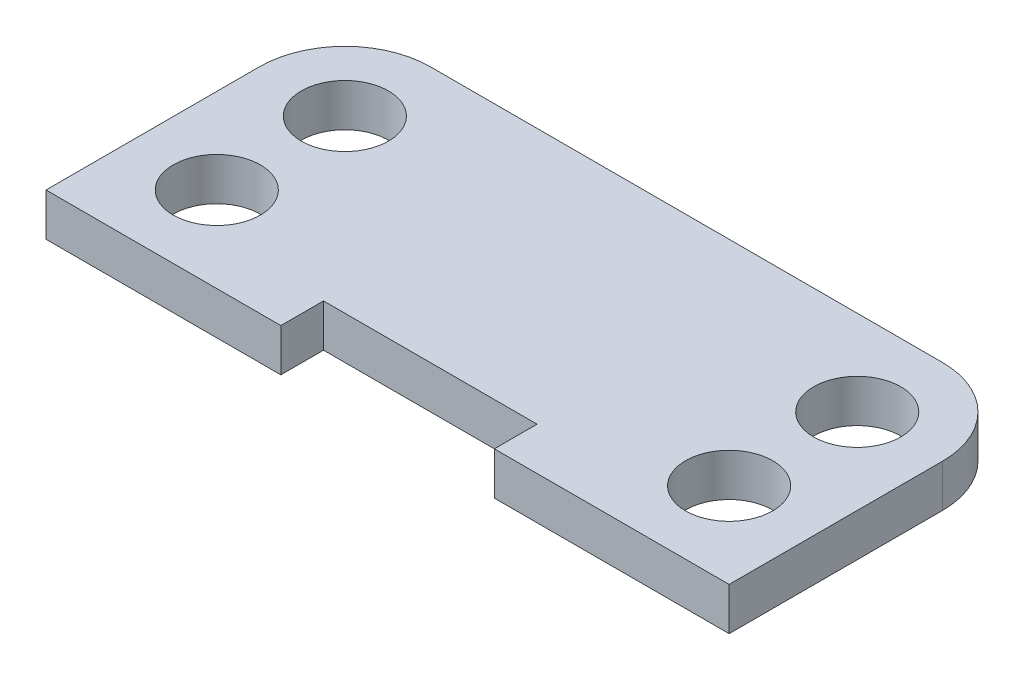
ISO-10303-21;
HEADER;
FILE_DESCRIPTION(('STEP AP214'),'2;1');
FILE_NAME('part.step','',(''),(''),'','','');
FILE_SCHEMA(('AUTOMOTIVE_DESIGN { 1 0 10303 214 1 1 1 1 }'));
ENDSEC;
DATA;
#1=APPLICATION_CONTEXT('core data for automotive mechanical design processes');
#2=APPLICATION_PROTOCOL_DEFINITION('international standard','automotive_design',2000,#1);
#3=PRODUCT_CONTEXT('',#1,'mechanical');
#4=PRODUCT('Part','Part','',(#3));
#5=PRODUCT_RELATED_PRODUCT_CATEGORY('part','',(#4));
#6=PRODUCT_DEFINITION_FORMATION('','',#4);
#7=PRODUCT_DEFINITION_CONTEXT('part definition',#1,'design');
#8=PRODUCT_DEFINITION('design','',#6,#7);
#9=PRODUCT_DEFINITION_SHAPE('','',#8);
#10=(LENGTH_UNIT() NAMED_UNIT(*) SI_UNIT(.MILLI.,.METRE.));
#11=(NAMED_UNIT(*) PLANE_ANGLE_UNIT() SI_UNIT($,.RADIAN.));
#12=(NAMED_UNIT(*) SI_UNIT($,.STERADIAN.) SOLID_ANGLE_UNIT());
#13=UNCERTAINTY_MEASURE_WITH_UNIT(LENGTH_MEASURE(1.E-05),#10,'distance_accuracy_value','');
#14=(GEOMETRIC_REPRESENTATION_CONTEXT(3) GLOBAL_UNCERTAINTY_ASSIGNED_CONTEXT((#13)) GLOBAL_UNIT_ASSIGNED_CONTEXT((#10,
#11,#12)) REPRESENTATION_CONTEXT('',''));
#15=CARTESIAN_POINT('',(0.,0.,0.));
#16=DIRECTION('',(0.,0.,1.));
#17=DIRECTION('',(1.,0.,0.));
#18=AXIS2_PLACEMENT_3D('',#15,#16,#17);
#19=CARTESIAN_POINT('',(38.1,3.175,-25.4));
#20=DIRECTION('',(0.,-1.,0.));
#21=DIRECTION('',(0.,0.,-1.));
#22=AXIS2_PLACEMENT_3D('',#19,#20,#21);
#23=PLANE('',#22);
#24=DIRECTION('',(1.,0.,0.));
#25=VECTOR('',#24,1.);
#26=CARTESIAN_POINT('',(-50.8,3.175,6.35000000000001));
#27=LINE('',#26,#25);
#28=CARTESIAN_POINT('',(-50.8,3.175,6.35000000000001));
#29=VERTEX_POINT('',#28);
#30=CARTESIAN_POINT('',(-15.875,3.175,6.35));
#31=VERTEX_POINT('',#30);
#32=EDGE_CURVE('E199',#29,#31,#27,.T.);
#33=ORIENTED_EDGE('',*,*,#32,.T.);
#34=DIRECTION('',(0.,0.,-1.));
#35=VECTOR('',#34,1.);
#36=CARTESIAN_POINT('',(-15.875,3.175,6.35));
#37=LINE('',#36,#35);
#38=CARTESIAN_POINT('',(-15.875,3.175,0.));
#39=VERTEX_POINT('',#38);
#40=EDGE_CURVE('E122',#31,#39,#37,.T.);
#41=ORIENTED_EDGE('',*,*,#40,.T.);
#42=DIRECTION('',(1.,0.,0.));
#43=VECTOR('',#42,1.);
#44=CARTESIAN_POINT('',(-15.875,3.175,0.));
#45=LINE('',#44,#43);
#46=CARTESIAN_POINT('',(15.875,3.175,0.));
#47=VERTEX_POINT('',#46);
#48=EDGE_CURVE('E229',#39,#47,#45,.T.);
#49=ORIENTED_EDGE('',*,*,#48,.T.);
#50=DIRECTION('',(0.,0.,1.));
#51=VECTOR('',#50,1.);
#52=CARTESIAN_POINT('',(15.875,3.175,0.));
#53=LINE('',#52,#51);
#54=CARTESIAN_POINT('',(15.875,3.175,6.35));
#55=VERTEX_POINT('',#54);
#56=EDGE_CURVE('E249',#47,#55,#53,.T.);
#57=ORIENTED_EDGE('',*,*,#56,.T.);
#58=DIRECTION('',(1.,0.,0.));
#59=VECTOR('',#58,1.);
#60=CARTESIAN_POINT('',(15.875,3.175,6.35));
#61=LINE('',#60,#59);
#62=CARTESIAN_POINT('',(50.8,3.175,6.35));
#63=VERTEX_POINT('',#62);
#64=EDGE_CURVE('E245',#55,#63,#61,.T.);
#65=ORIENTED_EDGE('',*,*,#64,.T.);
#66=DIRECTION('',(0.,0.,-1.));
#67=VECTOR('',#66,1.);
#68=CARTESIAN_POINT('',(50.8,3.175,6.35));
#69=LINE('',#68,#67);
#70=CARTESIAN_POINT('',(50.8,3.175,-25.3999999999999));
#71=VERTEX_POINT('',#70);
#72=EDGE_CURVE('E248',#63,#71,#69,.T.);
#73=ORIENTED_EDGE('',*,*,#72,.T.);
#74=CARTESIAN_POINT('',(38.1,3.175,-25.4));
#75=DIRECTION('',(0.,1.,0.));
#76=DIRECTION('',(0.,0.,-1.));
#77=AXIS2_PLACEMENT_3D('',#74,#75,#76);
#78=CIRCLE('',#77,12.7);
#79=CARTESIAN_POINT('',(38.0999999999999,3.175,-38.1));
#80=VERTEX_POINT('',#79);
#81=EDGE_CURVE('E147',#71,#80,#78,.T.);
#82=ORIENTED_EDGE('',*,*,#81,.T.);
#83=DIRECTION('',(-1.,0.,0.));
#84=VECTOR('',#83,1.);
#85=CARTESIAN_POINT('',(38.0999999999999,3.175,-38.1));
#86=LINE('',#85,#84);
#87=CARTESIAN_POINT('',(-38.0999999999999,3.175,-38.1));
#88=VERTEX_POINT('',#87);
#89=EDGE_CURVE('E141',#80,#88,#86,.T.);
#90=ORIENTED_EDGE('',*,*,#89,.T.);
#91=CARTESIAN_POINT('',(-38.1,3.175,-25.4));
#92=DIRECTION('',(0.,1.,0.));
#93=DIRECTION('',(0.,0.,1.));
#94=AXIS2_PLACEMENT_3D('',#91,#92,#93);
#95=CIRCLE('',#94,12.7);
#96=CARTESIAN_POINT('',(-50.8,3.175,-25.3999999999999));
#97=VERTEX_POINT('',#96);
#98=EDGE_CURVE('E145',#88,#97,#95,.T.);
#99=ORIENTED_EDGE('',*,*,#98,.T.);
#100=DIRECTION('',(0.,0.,1.));
#101=VECTOR('',#100,1.);
#102=CARTESIAN_POINT('',(-50.8,3.175,-25.3999999999999));
#103=LINE('',#102,#101);
#104=EDGE_CURVE('E73',#97,#29,#103,.T.);
#105=ORIENTED_EDGE('',*,*,#104,.T.);
#106=EDGE_LOOP('',(#33,#41,#49,#57,#65,#73,#82,#90,#99,#105));
#107=FACE_BOUND('',#106,.T.);
#108=CARTESIAN_POINT('',(-38.1,3.175,-25.4));
#109=DIRECTION('',(0.,1.,0.));
#110=DIRECTION('',(0.,0.,1.));
#111=AXIS2_PLACEMENT_3D('',#108,#109,#110);
#112=CIRCLE('',#111,6.477);
#113=CARTESIAN_POINT('',(-38.1,3.175,-18.923));
#114=VERTEX_POINT('',#113);
#115=EDGE_CURVE('E175',#114,#114,#112,.T.);
#116=ORIENTED_EDGE('',*,*,#115,.F.);
#117=EDGE_LOOP('',(#116));
#118=FACE_BOUND('',#117,.T.);
#119=CARTESIAN_POINT('',(-38.1,3.175,-6.34999999999998));
#120=DIRECTION('',(0.,1.,0.));
#121=DIRECTION('',(0.,0.,1.));
#122=AXIS2_PLACEMENT_3D('',#119,#120,#121);
#123=CIRCLE('',#122,6.477);
#124=CARTESIAN_POINT('',(-38.1,3.175,0.127000000000019));
#125=VERTEX_POINT('',#124);
#126=EDGE_CURVE('E271',#125,#125,#123,.T.);
#127=ORIENTED_EDGE('',*,*,#126,.F.);
#128=EDGE_LOOP('',(#127));
#129=FACE_BOUND('',#128,.T.);
#130=CARTESIAN_POINT('',(38.1,3.175,-25.4));
#131=DIRECTION('',(0.,1.,0.));
#132=DIRECTION('',(0.,0.,1.));
#133=AXIS2_PLACEMENT_3D('',#130,#131,#132);
#134=CIRCLE('',#133,6.477);
#135=CARTESIAN_POINT('',(38.1,3.175,-18.923));
#136=VERTEX_POINT('',#135);
#137=EDGE_CURVE('E279',#136,#136,#134,.T.);
#138=ORIENTED_EDGE('',*,*,#137,.F.);
#139=EDGE_LOOP('',(#138));
#140=FACE_BOUND('',#139,.T.);
#141=CARTESIAN_POINT('',(38.1,3.175,-6.34999999999998));
#142=DIRECTION('',(0.,1.,0.));
#143=DIRECTION('',(0.,0.,1.));
#144=AXIS2_PLACEMENT_3D('',#141,#142,#143);
#145=CIRCLE('',#144,6.477);
#146=CARTESIAN_POINT('',(38.1,3.175,0.127000000000019));
#147=VERTEX_POINT('',#146);
#148=EDGE_CURVE('E287',#147,#147,#145,.T.);
#149=ORIENTED_EDGE('',*,*,#148,.F.);
#150=EDGE_LOOP('',(#149));
#151=FACE_BOUND('',#150,.T.);
#152=ADVANCED_FACE('F55',(#107,#118,#129,#140,#151),#23,.F.);
#153=CARTESIAN_POINT('',(38.1,-3.175,-25.4));
#154=DIRECTION('',(0.,-1.,0.));
#155=DIRECTION('',(0.,0.,-1.));
#156=AXIS2_PLACEMENT_3D('',#153,#154,#155);
#157=PLANE('',#156);
#158=CARTESIAN_POINT('',(38.1,-3.175,-25.4));
#159=DIRECTION('',(0.,1.,0.));
#160=DIRECTION('',(0.,0.,1.));
#161=AXIS2_PLACEMENT_3D('',#158,#159,#160);
#162=CIRCLE('',#161,6.477);
#163=CARTESIAN_POINT('',(38.1,-3.175,-18.923));
#164=VERTEX_POINT('',#163);
#165=EDGE_CURVE('E283',#164,#164,#162,.T.);
#166=ORIENTED_EDGE('',*,*,#165,.T.);
#167=EDGE_LOOP('',(#166));
#168=FACE_BOUND('',#167,.T.);
#169=CARTESIAN_POINT('',(-38.1,-3.175,-25.4));
#170=DIRECTION('',(0.,1.,0.));
#171=DIRECTION('',(0.,0.,1.));
#172=AXIS2_PLACEMENT_3D('',#169,#170,#171);
#173=CIRCLE('',#172,6.477);
#174=CARTESIAN_POINT('',(-38.1,-3.175,-18.923));
#175=VERTEX_POINT('',#174);
#176=EDGE_CURVE('E267',#175,#175,#173,.T.);
#177=ORIENTED_EDGE('',*,*,#176,.T.);
#178=EDGE_LOOP('',(#177));
#179=FACE_BOUND('',#178,.T.);
#180=DIRECTION('',(1.,0.,0.));
#181=VECTOR('',#180,1.);
#182=CARTESIAN_POINT('',(-50.8,-3.175,6.35000000000001));
#183=LINE('',#182,#181);
#184=CARTESIAN_POINT('',(-50.8,-3.175,6.35000000000001));
#185=VERTEX_POINT('',#184);
#186=CARTESIAN_POINT('',(-15.875,-3.175,6.35));
#187=VERTEX_POINT('',#186);
#188=EDGE_CURVE('E170',#185,#187,#183,.T.);
#189=ORIENTED_EDGE('',*,*,#188,.F.);
#190=DIRECTION('',(0.,0.,1.));
#191=VECTOR('',#190,1.);
#192=CARTESIAN_POINT('',(-50.8,-3.175,-25.3999999999999));
#193=LINE('',#192,#191);
#194=CARTESIAN_POINT('',(-50.8,-3.175,-25.3999999999999));
#195=VERTEX_POINT('',#194);
#196=EDGE_CURVE('E114',#195,#185,#193,.T.);
#197=ORIENTED_EDGE('',*,*,#196,.F.);
#198=CARTESIAN_POINT('',(-38.1,-3.175,-25.4));
#199=DIRECTION('',(0.,1.,0.));
#200=DIRECTION('',(0.,0.,1.));
#201=AXIS2_PLACEMENT_3D('',#198,#199,#200);
#202=CIRCLE('',#201,12.7);
#203=CARTESIAN_POINT('',(-38.0999999999999,-3.175,-38.1));
#204=VERTEX_POINT('',#203);
#205=EDGE_CURVE('E108',#204,#195,#202,.T.);
#206=ORIENTED_EDGE('',*,*,#205,.F.);
#207=DIRECTION('',(-1.,0.,0.));
#208=VECTOR('',#207,1.);
#209=CARTESIAN_POINT('',(38.0999999999999,-3.175,-38.1));
#210=LINE('',#209,#208);
#211=CARTESIAN_POINT('',(38.0999999999999,-3.175,-38.1));
#212=VERTEX_POINT('',#211);
#213=EDGE_CURVE('E156',#212,#204,#210,.T.);
#214=ORIENTED_EDGE('',*,*,#213,.F.);
#215=CARTESIAN_POINT('',(38.1,-3.175,-25.4));
#216=DIRECTION('',(0.,1.,0.));
#217=DIRECTION('',(0.,0.,-1.));
#218=AXIS2_PLACEMENT_3D('',#215,#216,#217);
#219=CIRCLE('',#218,12.7);
#220=CARTESIAN_POINT('',(50.8,-3.175,-25.3999999999999));
#221=VERTEX_POINT('',#220);
#222=EDGE_CURVE('E190',#221,#212,#219,.T.);
#223=ORIENTED_EDGE('',*,*,#222,.F.);
#224=DIRECTION('',(0.,0.,-1.));
#225=VECTOR('',#224,1.);
#226=CARTESIAN_POINT('',(50.8,-3.175,6.35));
#227=LINE('',#226,#225);
#228=CARTESIAN_POINT('',(50.8,-3.175,6.35));
#229=VERTEX_POINT('',#228);
#230=EDGE_CURVE('E187',#229,#221,#227,.T.);
#231=ORIENTED_EDGE('',*,*,#230,.F.);
#232=DIRECTION('',(1.,0.,0.));
#233=VECTOR('',#232,1.);
#234=CARTESIAN_POINT('',(15.875,-3.175,6.35));
#235=LINE('',#234,#233);
#236=CARTESIAN_POINT('',(15.875,-3.175,6.35));
#237=VERTEX_POINT('',#236);
#238=EDGE_CURVE('E184',#237,#229,#235,.T.);
#239=ORIENTED_EDGE('',*,*,#238,.F.);
#240=DIRECTION('',(0.,0.,1.));
#241=VECTOR('',#240,1.);
#242=CARTESIAN_POINT('',(15.875,-3.175,0.));
#243=LINE('',#242,#241);
#244=CARTESIAN_POINT('',(15.875,-3.175,0.));
#245=VERTEX_POINT('',#244);
#246=EDGE_CURVE('E181',#245,#237,#243,.T.);
#247=ORIENTED_EDGE('',*,*,#246,.F.);
#248=DIRECTION('',(1.,0.,0.));
#249=VECTOR('',#248,1.);
#250=CARTESIAN_POINT('',(-15.875,-3.175,0.));
#251=LINE('',#250,#249);
#252=CARTESIAN_POINT('',(-15.875,-3.175,0.));
#253=VERTEX_POINT('',#252);
#254=EDGE_CURVE('E178',#253,#245,#251,.T.);
#255=ORIENTED_EDGE('',*,*,#254,.F.);
#256=DIRECTION('',(0.,0.,-1.));
#257=VECTOR('',#256,1.);
#258=CARTESIAN_POINT('',(-15.875,-3.175,6.35));
#259=LINE('',#258,#257);
#260=EDGE_CURVE('E174',#187,#253,#259,.T.);
#261=ORIENTED_EDGE('',*,*,#260,.F.);
#262=EDGE_LOOP('',(#189,#197,#206,#214,#223,#231,#239,#247,#255,#261));
#263=FACE_BOUND('',#262,.T.);
#264=CARTESIAN_POINT('',(-38.1,-3.175,-6.34999999999998));
#265=DIRECTION('',(0.,1.,0.));
#266=DIRECTION('',(0.,0.,1.));
#267=AXIS2_PLACEMENT_3D('',#264,#265,#266);
#268=CIRCLE('',#267,6.477);
#269=CARTESIAN_POINT('',(-38.1,-3.175,0.127000000000019));
#270=VERTEX_POINT('',#269);
#271=EDGE_CURVE('E275',#270,#270,#268,.T.);
#272=ORIENTED_EDGE('',*,*,#271,.T.);
#273=EDGE_LOOP('',(#272));
#274=FACE_BOUND('',#273,.T.);
#275=CARTESIAN_POINT('',(38.1,-3.175,-6.34999999999998));
#276=DIRECTION('',(0.,1.,0.));
#277=DIRECTION('',(0.,0.,1.));
#278=AXIS2_PLACEMENT_3D('',#275,#276,#277);
#279=CIRCLE('',#278,6.477);
#280=CARTESIAN_POINT('',(38.1,-3.175,0.127000000000019));
#281=VERTEX_POINT('',#280);
#282=EDGE_CURVE('E291',#281,#281,#279,.T.);
#283=ORIENTED_EDGE('',*,*,#282,.T.);
#284=EDGE_LOOP('',(#283));
#285=FACE_BOUND('',#284,.T.);
#286=ADVANCED_FACE('F233',(#168,#179,#263,#274,#285),#157,.T.);
#287=CARTESIAN_POINT('',(-50.8,3.175,6.35000000000001));
#288=DIRECTION('',(0.,0.,-1.));
#289=DIRECTION('',(-1.,0.,0.));
#290=AXIS2_PLACEMENT_3D('',#287,#288,#289);
#291=PLANE('',#290);
#292=ORIENTED_EDGE('',*,*,#188,.T.);
#293=DIRECTION('',(0.,-1.,0.));
#294=VECTOR('',#293,1.);
#295=CARTESIAN_POINT('',(-15.875,3.175,6.35));
#296=LINE('',#295,#294);
#297=EDGE_CURVE('E13',#31,#187,#296,.T.);
#298=ORIENTED_EDGE('',*,*,#297,.F.);
#299=ORIENTED_EDGE('',*,*,#32,.F.);
#300=DIRECTION('',(0.,-1.,0.));
#301=VECTOR('',#300,1.);
#302=CARTESIAN_POINT('',(-50.8,3.175,6.35000000000001));
#303=LINE('',#302,#301);
#304=EDGE_CURVE('E166',#29,#185,#303,.T.);
#305=ORIENTED_EDGE('',*,*,#304,.T.);
#306=EDGE_LOOP('',(#292,#298,#299,#305));
#307=FACE_BOUND('',#306,.T.);
#308=ADVANCED_FACE('F57',(#307),#291,.F.);
#309=CARTESIAN_POINT('',(-15.875,3.175,6.35));
#310=DIRECTION('',(-1.,0.,0.));
#311=DIRECTION('',(0.,0.,1.));
#312=AXIS2_PLACEMENT_3D('',#309,#310,#311);
#313=PLANE('',#312);
#314=ORIENTED_EDGE('',*,*,#260,.T.);
#315=DIRECTION('',(0.,-1.,0.));
#316=VECTOR('',#315,1.);
#317=CARTESIAN_POINT('',(-15.875,3.175,0.));
#318=LINE('',#317,#316);
#319=EDGE_CURVE('E65',#39,#253,#318,.T.);
#320=ORIENTED_EDGE('',*,*,#319,.F.);
#321=ORIENTED_EDGE('',*,*,#40,.F.);
#322=ORIENTED_EDGE('',*,*,#297,.T.);
#323=EDGE_LOOP('',(#314,#320,#321,#322));
#324=FACE_BOUND('',#323,.T.);
#325=ADVANCED_FACE('F334',(#324),#313,.F.);
#326=CARTESIAN_POINT('',(-15.875,3.175,0.));
#327=DIRECTION('',(0.,0.,-1.));
#328=DIRECTION('',(-1.,0.,0.));
#329=AXIS2_PLACEMENT_3D('',#326,#327,#328);
#330=PLANE('',#329);
#331=ORIENTED_EDGE('',*,*,#254,.T.);
#332=DIRECTION('',(0.,-1.,0.));
#333=VECTOR('',#332,1.);
#334=CARTESIAN_POINT('',(15.875,3.175,0.));
#335=LINE('',#334,#333);
#336=EDGE_CURVE('E218',#47,#245,#335,.T.);
#337=ORIENTED_EDGE('',*,*,#336,.F.);
#338=ORIENTED_EDGE('',*,*,#48,.F.);
#339=ORIENTED_EDGE('',*,*,#319,.T.);
#340=EDGE_LOOP('',(#331,#337,#338,#339));
#341=FACE_BOUND('',#340,.T.);
#342=ADVANCED_FACE('F227',(#341),#330,.F.);
#343=CARTESIAN_POINT('',(15.875,3.175,0.));
#344=DIRECTION('',(1.,0.,0.));
#345=DIRECTION('',(0.,0.,-1.));
#346=AXIS2_PLACEMENT_3D('',#343,#344,#345);
#347=PLANE('',#346);
#348=ORIENTED_EDGE('',*,*,#246,.T.);
#349=DIRECTION('',(0.,-1.,0.));
#350=VECTOR('',#349,1.);
#351=CARTESIAN_POINT('',(15.875,3.175,6.35));
#352=LINE('',#351,#350);
#353=EDGE_CURVE('E214',#55,#237,#352,.T.);
#354=ORIENTED_EDGE('',*,*,#353,.F.);
#355=ORIENTED_EDGE('',*,*,#56,.F.);
#356=ORIENTED_EDGE('',*,*,#336,.T.);
#357=EDGE_LOOP('',(#348,#354,#355,#356));
#358=FACE_BOUND('',#357,.T.);
#359=ADVANCED_FACE('F239',(#358),#347,.F.);
#360=CARTESIAN_POINT('',(15.875,3.175,6.35));
#361=DIRECTION('',(0.,0.,-1.));
#362=DIRECTION('',(-1.,0.,0.));
#363=AXIS2_PLACEMENT_3D('',#360,#361,#362);
#364=PLANE('',#363);
#365=ORIENTED_EDGE('',*,*,#238,.T.);
#366=DIRECTION('',(0.,-1.,0.));
#367=VECTOR('',#366,1.);
#368=CARTESIAN_POINT('',(50.8,3.175,6.35));
#369=LINE('',#368,#367);
#370=EDGE_CURVE('E210',#63,#229,#369,.T.);
#371=ORIENTED_EDGE('',*,*,#370,.F.);
#372=ORIENTED_EDGE('',*,*,#64,.F.);
#373=ORIENTED_EDGE('',*,*,#353,.T.);
#374=EDGE_LOOP('',(#365,#371,#372,#373));
#375=FACE_BOUND('',#374,.T.);
#376=ADVANCED_FACE('F243',(#375),#364,.F.);
#377=CARTESIAN_POINT('',(50.8,3.175,6.35));
#378=DIRECTION('',(-1.,0.,0.));
#379=DIRECTION('',(0.,0.,1.));
#380=AXIS2_PLACEMENT_3D('',#377,#378,#379);
#381=PLANE('',#380);
#382=ORIENTED_EDGE('',*,*,#230,.T.);
#383=DIRECTION('',(0.,-1.,0.));
#384=VECTOR('',#383,1.);
#385=CARTESIAN_POINT('',(50.8,3.175,-25.3999999999999));
#386=LINE('',#385,#384);
#387=EDGE_CURVE('E206',#71,#221,#386,.T.);
#388=ORIENTED_EDGE('',*,*,#387,.F.);
#389=ORIENTED_EDGE('',*,*,#72,.F.);
#390=ORIENTED_EDGE('',*,*,#370,.T.);
#391=EDGE_LOOP('',(#382,#388,#389,#390));
#392=FACE_BOUND('',#391,.T.);
#393=ADVANCED_FACE('F324',(#392),#381,.F.);
#394=CARTESIAN_POINT('',(38.1,3.175,-25.4));
#395=DIRECTION('',(0.,-1.,0.));
#396=DIRECTION('',(0.,0.,-1.));
#397=AXIS2_PLACEMENT_3D('',#394,#395,#396);
#398=CYLINDRICAL_SURFACE('',#397,12.7);
#399=ORIENTED_EDGE('',*,*,#222,.T.);
#400=DIRECTION('',(0.,-1.,0.));
#401=VECTOR('',#400,1.);
#402=CARTESIAN_POINT('',(38.0999999999999,3.175,-38.1));
#403=LINE('',#402,#401);
#404=EDGE_CURVE('E158',#80,#212,#403,.T.);
#405=ORIENTED_EDGE('',*,*,#404,.F.);
#406=ORIENTED_EDGE('',*,*,#81,.F.);
#407=ORIENTED_EDGE('',*,*,#387,.T.);
#408=EDGE_LOOP('',(#399,#405,#406,#407));
#409=FACE_BOUND('',#408,.T.);
#410=ADVANCED_FACE('F321',(#409),#398,.T.);
#411=CARTESIAN_POINT('',(38.0999999999999,3.175,-38.1));
#412=DIRECTION('',(0.,0.,1.));
#413=DIRECTION('',(1.,0.,0.));
#414=AXIS2_PLACEMENT_3D('',#411,#412,#413);
#415=PLANE('',#414);
#416=ORIENTED_EDGE('',*,*,#213,.T.);
#417=DIRECTION('',(0.,-1.,0.));
#418=VECTOR('',#417,1.);
#419=CARTESIAN_POINT('',(-38.0999999999999,3.175,-38.1));
#420=LINE('',#419,#418);
#421=EDGE_CURVE('E153',#88,#204,#420,.T.);
#422=ORIENTED_EDGE('',*,*,#421,.F.);
#423=ORIENTED_EDGE('',*,*,#89,.F.);
#424=ORIENTED_EDGE('',*,*,#404,.T.);
#425=EDGE_LOOP('',(#416,#422,#423,#424));
#426=FACE_BOUND('',#425,.T.);
#427=ADVANCED_FACE('F154',(#426),#415,.F.);
#428=CARTESIAN_POINT('',(-38.1,3.175,-25.4));
#429=DIRECTION('',(0.,-1.,0.));
#430=DIRECTION('',(0.,0.,-1.));
#431=AXIS2_PLACEMENT_3D('',#428,#429,#430);
#432=CYLINDRICAL_SURFACE('',#431,12.7);
#433=ORIENTED_EDGE('',*,*,#205,.T.);
#434=DIRECTION('',(0.,-1.,0.));
#435=VECTOR('',#434,1.);
#436=CARTESIAN_POINT('',(-50.8,3.175,-25.3999999999999));
#437=LINE('',#436,#435);
#438=EDGE_CURVE('E159',#97,#195,#437,.T.);
#439=ORIENTED_EDGE('',*,*,#438,.F.);
#440=ORIENTED_EDGE('',*,*,#98,.F.);
#441=ORIENTED_EDGE('',*,*,#421,.T.);
#442=EDGE_LOOP('',(#433,#439,#440,#441));
#443=FACE_BOUND('',#442,.T.);
#444=ADVANCED_FACE('F161',(#443),#432,.T.);
#445=CARTESIAN_POINT('',(-50.8,3.175,-25.3999999999999));
#446=DIRECTION('',(1.,0.,0.));
#447=DIRECTION('',(0.,0.,-1.));
#448=AXIS2_PLACEMENT_3D('',#445,#446,#447);
#449=PLANE('',#448);
#450=ORIENTED_EDGE('',*,*,#196,.T.);
#451=ORIENTED_EDGE('',*,*,#304,.F.);
#452=ORIENTED_EDGE('',*,*,#104,.F.);
#453=ORIENTED_EDGE('',*,*,#438,.T.);
#454=EDGE_LOOP('',(#450,#451,#452,#453));
#455=FACE_BOUND('',#454,.T.);
#456=ADVANCED_FACE('F314',(#455),#449,.F.);
#457=CARTESIAN_POINT('',(-38.1,3.175,-25.4));
#458=DIRECTION('',(0.,-1.,0.));
#459=DIRECTION('',(0.,0.,-1.));
#460=AXIS2_PLACEMENT_3D('',#457,#458,#459);
#461=CYLINDRICAL_SURFACE('',#460,6.477);
#462=ORIENTED_EDGE('',*,*,#115,.T.);
#463=EDGE_LOOP('',(#462));
#464=FACE_BOUND('',#463,.T.);
#465=ORIENTED_EDGE('',*,*,#176,.F.);
#466=EDGE_LOOP('',(#465));
#467=FACE_BOUND('',#466,.T.);
#468=ADVANCED_FACE('F311',(#464,#467),#461,.F.);
#469=CARTESIAN_POINT('',(-38.1,3.175,-6.34999999999998));
#470=DIRECTION('',(0.,-1.,0.));
#471=DIRECTION('',(0.,0.,-1.));
#472=AXIS2_PLACEMENT_3D('',#469,#470,#471);
#473=CYLINDRICAL_SURFACE('',#472,6.477);
#474=ORIENTED_EDGE('',*,*,#126,.T.);
#475=EDGE_LOOP('',(#474));
#476=FACE_BOUND('',#475,.T.);
#477=ORIENTED_EDGE('',*,*,#271,.F.);
#478=EDGE_LOOP('',(#477));
#479=FACE_BOUND('',#478,.T.);
#480=ADVANCED_FACE('F409',(#476,#479),#473,.F.);
#481=CARTESIAN_POINT('',(38.1,3.175,-25.4));
#482=DIRECTION('',(0.,-1.,0.));
#483=DIRECTION('',(0.,0.,-1.));
#484=AXIS2_PLACEMENT_3D('',#481,#482,#483);
#485=CYLINDRICAL_SURFACE('',#484,6.477);
#486=ORIENTED_EDGE('',*,*,#137,.T.);
#487=EDGE_LOOP('',(#486));
#488=FACE_BOUND('',#487,.T.);
#489=ORIENTED_EDGE('',*,*,#165,.F.);
#490=EDGE_LOOP('',(#489));
#491=FACE_BOUND('',#490,.T.);
#492=ADVANCED_FACE('F417',(#488,#491),#485,.F.);
#493=CARTESIAN_POINT('',(38.1,3.175,-6.34999999999998));
#494=DIRECTION('',(0.,-1.,0.));
#495=DIRECTION('',(0.,0.,-1.));
#496=AXIS2_PLACEMENT_3D('',#493,#494,#495);
#497=CYLINDRICAL_SURFACE('',#496,6.477);
#498=ORIENTED_EDGE('',*,*,#148,.T.);
#499=EDGE_LOOP('',(#498));
#500=FACE_BOUND('',#499,.T.);
#501=ORIENTED_EDGE('',*,*,#282,.F.);
#502=EDGE_LOOP('',(#501));
#503=FACE_BOUND('',#502,.T.);
#504=ADVANCED_FACE('F300',(#500,#503),#497,.F.);
#505=CLOSED_SHELL('',(#152,#286,#308,#325,#342,#359,#376,#393,#410,#427,#444,#456,#468,#480,
#492,#504));
#506=MANIFOLD_SOLID_BREP('B2',#505);
#507=ADVANCED_BREP_SHAPE_REPRESENTATION('',(#18,#506),#14);
#508=SHAPE_DEFINITION_REPRESENTATION(#9,#507);
ENDSEC;
END-ISO-10303-21;
